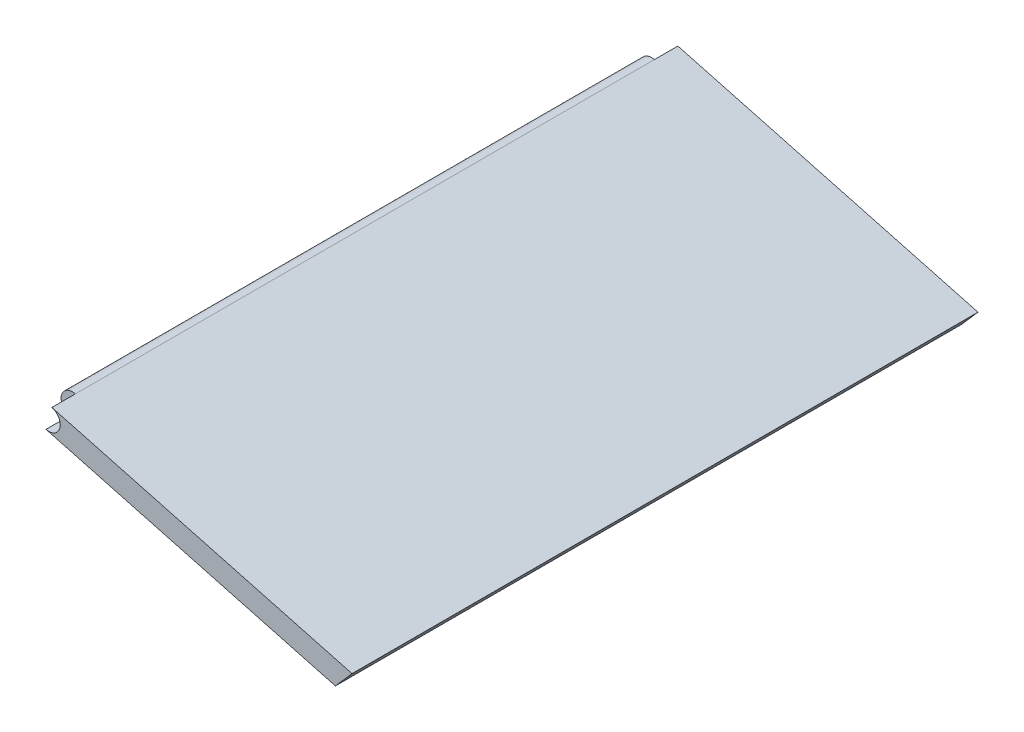
ISO-10303-21;
HEADER;
FILE_DESCRIPTION(('STEP AP214'),'2;1');
FILE_NAME('part.step','',(''),(''),'','','');
FILE_SCHEMA(('AUTOMOTIVE_DESIGN { 1 0 10303 214 1 1 1 1 }'));
ENDSEC;
DATA;
#1=APPLICATION_CONTEXT('core data for automotive mechanical design processes');
#2=APPLICATION_PROTOCOL_DEFINITION('international standard','automotive_design',2000,#1);
#3=PRODUCT_CONTEXT('',#1,'mechanical');
#4=PRODUCT('Part','Part','',(#3));
#5=PRODUCT_RELATED_PRODUCT_CATEGORY('part','',(#4));
#6=PRODUCT_DEFINITION_FORMATION('','',#4);
#7=PRODUCT_DEFINITION_CONTEXT('part definition',#1,'design');
#8=PRODUCT_DEFINITION('design','',#6,#7);
#9=PRODUCT_DEFINITION_SHAPE('','',#8);
#10=(LENGTH_UNIT() NAMED_UNIT(*) SI_UNIT(.MILLI.,.METRE.));
#11=(NAMED_UNIT(*) PLANE_ANGLE_UNIT() SI_UNIT($,.RADIAN.));
#12=(NAMED_UNIT(*) SI_UNIT($,.STERADIAN.) SOLID_ANGLE_UNIT());
#13=UNCERTAINTY_MEASURE_WITH_UNIT(LENGTH_MEASURE(1.E-05),#10,'distance_accuracy_value','');
#14=(GEOMETRIC_REPRESENTATION_CONTEXT(3) GLOBAL_UNCERTAINTY_ASSIGNED_CONTEXT((#13)) GLOBAL_UNIT_ASSIGNED_CONTEXT((#10,
#11,#12)) REPRESENTATION_CONTEXT('',''));
#15=CARTESIAN_POINT('',(0.,0.,0.));
#16=DIRECTION('',(0.,0.,1.));
#17=DIRECTION('',(1.,0.,0.));
#18=AXIS2_PLACEMENT_3D('',#15,#16,#17);
#19=CARTESIAN_POINT('',(-3.75000000000005,-13.9951905283833,840.980762113533));
#20=DIRECTION('',(0.,0.,-1.));
#21=DIRECTION('',(-1.,0.,0.));
#22=AXIS2_PLACEMENT_3D('',#19,#20,#21);
#23=CYLINDRICAL_SURFACE('',#22,14.488887394336);
#24=CARTESIAN_POINT('',(-3.75000000000005,-13.9951905283833,770.));
#25=DIRECTION('',(0.,0.,-1.));
#26=DIRECTION('',(-1.,0.,0.));
#27=AXIS2_PLACEMENT_3D('',#24,#25,#26);
#28=CIRCLE('',#27,14.488887394336);
#29=CARTESIAN_POINT('',(-7.50000000000011,-27.9903810567665,770.));
#30=VERTEX_POINT('',#29);
#31=CARTESIAN_POINT('',(0.,0.,770.));
#32=VERTEX_POINT('',#31);
#33=EDGE_CURVE('E140',#30,#32,#28,.T.);
#34=ORIENTED_EDGE('',*,*,#33,.T.);
#35=DIRECTION('',(0.,0.,-1.));
#36=VECTOR('',#35,1.);
#37=CARTESIAN_POINT('',(0.,0.,800.));
#38=LINE('',#37,#36);
#39=CARTESIAN_POINT('',(0.,0.,30.));
#40=VERTEX_POINT('',#39);
#41=EDGE_CURVE('E114',#32,#40,#38,.T.);
#42=ORIENTED_EDGE('',*,*,#41,.T.);
#43=CARTESIAN_POINT('',(-3.75000000000005,-13.9951905283833,30.));
#44=DIRECTION('',(0.,0.,-1.));
#45=DIRECTION('',(-1.,0.,0.));
#46=AXIS2_PLACEMENT_3D('',#43,#44,#45);
#47=CIRCLE('',#46,14.488887394336);
#48=CARTESIAN_POINT('',(-7.50000000000011,-27.9903810567665,30.));
#49=VERTEX_POINT('',#48);
#50=EDGE_CURVE('E11',#40,#49,#47,.F.);
#51=ORIENTED_EDGE('',*,*,#50,.T.);
#52=DIRECTION('',(0.,0.,-1.));
#53=VECTOR('',#52,1.);
#54=CARTESIAN_POINT('',(-7.50000000000011,-27.9903810567665,800.));
#55=LINE('',#54,#53);
#56=EDGE_CURVE('E49',#30,#49,#55,.T.);
#57=ORIENTED_EDGE('',*,*,#56,.F.);
#58=EDGE_LOOP('',(#34,#42,#51,#57));
#59=FACE_BOUND('',#58,.T.);
#60=ADVANCED_FACE('F34',(#59),#23,.T.);
#61=CARTESIAN_POINT('',(362.338095957555,-127.088200198859,800.));
#62=DIRECTION('',(0.258819045102525,0.965925826289067,0.));
#63=DIRECTION('',(-0.965925826289067,0.258819045102525,0.));
#64=AXIS2_PLACEMENT_3D('',#61,#62,#63);
#65=PLANE('',#64);
#66=DIRECTION('',(0.965925826289067,-0.258819045102525,0.));
#67=VECTOR('',#66,1.);
#68=CARTESIAN_POINT('',(362.338095957555,-127.088200198859,0.));
#69=LINE('',#68,#67);
#70=CARTESIAN_POINT('',(-7.50000000000011,-27.9903810567665,0.));
#71=VERTEX_POINT('',#70);
#72=CARTESIAN_POINT('',(362.338095957555,-127.088200198859,0.));
#73=VERTEX_POINT('',#72);
#74=EDGE_CURVE('E131',#71,#73,#69,.T.);
#75=ORIENTED_EDGE('',*,*,#74,.T.);
#76=DIRECTION('',(0.,0.,-1.));
#77=VECTOR('',#76,1.);
#78=CARTESIAN_POINT('',(362.338095957555,-127.088200198859,800.));
#79=LINE('',#78,#77);
#80=CARTESIAN_POINT('',(362.338095957555,-127.088200198859,800.));
#81=VERTEX_POINT('',#80);
#82=EDGE_CURVE('E117',#81,#73,#79,.T.);
#83=ORIENTED_EDGE('',*,*,#82,.F.);
#84=DIRECTION('',(0.965925826289067,-0.258819045102525,0.));
#85=VECTOR('',#84,1.);
#86=CARTESIAN_POINT('',(-7.50000000000011,-27.9903810567665,800.));
#87=LINE('',#86,#85);
#88=CARTESIAN_POINT('',(-7.50000000000011,-27.9903810567665,800.));
#89=VERTEX_POINT('',#88);
#90=EDGE_CURVE('E133',#89,#81,#87,.T.);
#91=ORIENTED_EDGE('',*,*,#90,.F.);
#92=EDGE_CURVE('E42',#89,#30,#55,.T.);
#93=ORIENTED_EDGE('',*,*,#92,.T.);
#94=ORIENTED_EDGE('',*,*,#56,.T.);
#95=EDGE_CURVE('E236',#49,#71,#55,.T.);
#96=ORIENTED_EDGE('',*,*,#95,.T.);
#97=EDGE_LOOP('',(#75,#83,#91,#93,#94,#96));
#98=FACE_BOUND('',#97,.T.);
#99=ADVANCED_FACE('F36',(#98),#65,.F.);
#100=CARTESIAN_POINT('',(383.588464135914,-102.782219191115,800.));
#101=DIRECTION('',(-0.752843184366101,0.658199923847997,0.));
#102=DIRECTION('',(-0.658199923847997,-0.752843184366101,0.));
#103=AXIS2_PLACEMENT_3D('',#100,#101,#102);
#104=PLANE('',#103);
#105=DIRECTION('',(0.658199923847997,0.752843184366101,0.));
#106=VECTOR('',#105,1.);
#107=CARTESIAN_POINT('',(383.588464135914,-102.782219191115,0.));
#108=LINE('',#107,#106);
#109=CARTESIAN_POINT('',(383.588464135914,-102.782219191115,0.));
#110=VERTEX_POINT('',#109);
#111=EDGE_CURVE('E72',#73,#110,#108,.T.);
#112=ORIENTED_EDGE('',*,*,#111,.T.);
#113=DIRECTION('',(0.,0.,-1.));
#114=VECTOR('',#113,1.);
#115=CARTESIAN_POINT('',(383.588464135914,-102.782219191115,800.));
#116=LINE('',#115,#114);
#117=CARTESIAN_POINT('',(383.588464135914,-102.782219191115,800.));
#118=VERTEX_POINT('',#117);
#119=EDGE_CURVE('E115',#118,#110,#116,.T.);
#120=ORIENTED_EDGE('',*,*,#119,.F.);
#121=DIRECTION('',(0.658199923847997,0.752843184366101,0.));
#122=VECTOR('',#121,1.);
#123=CARTESIAN_POINT('',(383.588464135914,-102.782219191115,800.));
#124=LINE('',#123,#122);
#125=EDGE_CURVE('E58',#81,#118,#124,.T.);
#126=ORIENTED_EDGE('',*,*,#125,.F.);
#127=ORIENTED_EDGE('',*,*,#82,.T.);
#128=EDGE_LOOP('',(#112,#120,#126,#127));
#129=FACE_BOUND('',#128,.T.);
#130=ADVANCED_FACE('F158',(#129),#104,.F.);
#131=CARTESIAN_POINT('',(0.,0.,800.));
#132=DIRECTION('',(-0.258819045102525,-0.965925826289067,0.));
#133=DIRECTION('',(0.965925826289067,-0.258819045102525,0.));
#134=AXIS2_PLACEMENT_3D('',#131,#132,#133);
#135=PLANE('',#134);
#136=DIRECTION('',(-0.965925826289067,0.258819045102525,0.));
#137=VECTOR('',#136,1.);
#138=CARTESIAN_POINT('',(0.,0.,0.));
#139=LINE('',#138,#137);
#140=CARTESIAN_POINT('',(0.,0.,0.));
#141=VERTEX_POINT('',#140);
#142=EDGE_CURVE('E130',#110,#141,#139,.T.);
#143=ORIENTED_EDGE('',*,*,#142,.T.);
#144=EDGE_CURVE('E108',#40,#141,#38,.T.);
#145=ORIENTED_EDGE('',*,*,#144,.F.);
#146=ORIENTED_EDGE('',*,*,#41,.F.);
#147=CARTESIAN_POINT('',(0.,0.,800.));
#148=VERTEX_POINT('',#147);
#149=EDGE_CURVE('E98',#148,#32,#38,.T.);
#150=ORIENTED_EDGE('',*,*,#149,.F.);
#151=DIRECTION('',(-0.965925826289067,0.258819045102525,0.));
#152=VECTOR('',#151,1.);
#153=CARTESIAN_POINT('',(0.,0.,800.));
#154=LINE('',#153,#152);
#155=EDGE_CURVE('E105',#118,#148,#154,.T.);
#156=ORIENTED_EDGE('',*,*,#155,.F.);
#157=ORIENTED_EDGE('',*,*,#119,.T.);
#158=EDGE_LOOP('',(#143,#145,#146,#150,#156,#157));
#159=FACE_BOUND('',#158,.T.);
#160=ADVANCED_FACE('F112',(#159),#135,.F.);
#161=CARTESIAN_POINT('',(0.,0.,800.));
#162=DIRECTION('',(0.,0.,1.));
#163=DIRECTION('',(1.,0.,0.));
#164=AXIS2_PLACEMENT_3D('',#161,#162,#163);
#165=PLANE('',#164);
#166=CARTESIAN_POINT('',(-3.75000000000005,-13.9951905283833,800.));
#167=DIRECTION('',(0.,0.,-1.));
#168=DIRECTION('',(-1.,0.,0.));
#169=AXIS2_PLACEMENT_3D('',#166,#167,#168);
#170=CIRCLE('',#169,14.488887394336);
#171=EDGE_CURVE('E95',#148,#89,#170,.T.);
#172=ORIENTED_EDGE('',*,*,#171,.T.);
#173=ORIENTED_EDGE('',*,*,#90,.T.);
#174=ORIENTED_EDGE('',*,*,#125,.T.);
#175=ORIENTED_EDGE('',*,*,#155,.T.);
#176=EDGE_LOOP('',(#172,#173,#174,#175));
#177=FACE_BOUND('',#176,.T.);
#178=ADVANCED_FACE('F106',(#177),#165,.T.);
#179=CARTESIAN_POINT('',(0.,0.,0.));
#180=DIRECTION('',(0.,0.,1.));
#181=DIRECTION('',(1.,0.,0.));
#182=AXIS2_PLACEMENT_3D('',#179,#180,#181);
#183=PLANE('',#182);
#184=ORIENTED_EDGE('',*,*,#74,.F.);
#185=CARTESIAN_POINT('',(-3.75000000000005,-13.9951905283833,0.));
#186=DIRECTION('',(0.,0.,-1.));
#187=DIRECTION('',(-1.,0.,0.));
#188=AXIS2_PLACEMENT_3D('',#185,#186,#187);
#189=CIRCLE('',#188,14.488887394336);
#190=EDGE_CURVE('E101',#141,#71,#189,.T.);
#191=ORIENTED_EDGE('',*,*,#190,.F.);
#192=ORIENTED_EDGE('',*,*,#142,.F.);
#193=ORIENTED_EDGE('',*,*,#111,.F.);
#194=EDGE_LOOP('',(#184,#191,#192,#193));
#195=FACE_BOUND('',#194,.T.);
#196=ADVANCED_FACE('F129',(#195),#183,.F.);
#197=CARTESIAN_POINT('',(-3.75000000000005,-13.9951905283833,30.));
#198=DIRECTION('',(0.,0.,-1.));
#199=DIRECTION('',(-1.,0.,0.));
#200=AXIS2_PLACEMENT_3D('',#197,#198,#199);
#201=CYLINDRICAL_SURFACE('',#200,14.488887394336);
#202=CARTESIAN_POINT('',(-3.75000000000005,-13.9951905283833,30.));
#203=DIRECTION('',(0.,0.,-1.));
#204=DIRECTION('',(-1.,0.,0.));
#205=AXIS2_PLACEMENT_3D('',#202,#203,#204);
#206=CIRCLE('',#205,14.488887394336);
#207=EDGE_CURVE('E125',#40,#49,#206,.T.);
#208=ORIENTED_EDGE('',*,*,#207,.F.);
#209=ORIENTED_EDGE('',*,*,#144,.T.);
#210=ORIENTED_EDGE('',*,*,#190,.T.);
#211=ORIENTED_EDGE('',*,*,#95,.F.);
#212=EDGE_LOOP('',(#208,#209,#210,#211));
#213=FACE_BOUND('',#212,.T.);
#214=ADVANCED_FACE('F123',(#213),#201,.F.);
#215=CARTESIAN_POINT('',(-3.75000000000005,-13.9951905283833,30.));
#216=DIRECTION('',(0.,0.,-1.));
#217=DIRECTION('',(-1.,0.,0.));
#218=AXIS2_PLACEMENT_3D('',#215,#216,#217);
#219=PLANE('',#218);
#220=ORIENTED_EDGE('',*,*,#207,.T.);
#221=ORIENTED_EDGE('',*,*,#50,.F.);
#222=EDGE_LOOP('',(#220,#221));
#223=FACE_BOUND('',#222,.T.);
#224=ADVANCED_FACE('F151',(#223),#219,.T.);
#225=CARTESIAN_POINT('',(-3.75000000000005,-13.9951905283833,800.));
#226=DIRECTION('',(0.,0.,-1.));
#227=DIRECTION('',(-1.,0.,0.));
#228=AXIS2_PLACEMENT_3D('',#225,#226,#227);
#229=CYLINDRICAL_SURFACE('',#228,14.488887394336);
#230=ORIENTED_EDGE('',*,*,#171,.F.);
#231=ORIENTED_EDGE('',*,*,#149,.T.);
#232=EDGE_CURVE('E102',#32,#30,#28,.T.);
#233=ORIENTED_EDGE('',*,*,#232,.T.);
#234=ORIENTED_EDGE('',*,*,#92,.F.);
#235=EDGE_LOOP('',(#230,#231,#233,#234));
#236=FACE_BOUND('',#235,.T.);
#237=ADVANCED_FACE('F96',(#236),#229,.F.);
#238=CARTESIAN_POINT('',(-3.75000000000005,-13.9951905283833,770.));
#239=DIRECTION('',(0.,0.,-1.));
#240=DIRECTION('',(-1.,0.,0.));
#241=AXIS2_PLACEMENT_3D('',#238,#239,#240);
#242=PLANE('',#241);
#243=ORIENTED_EDGE('',*,*,#232,.F.);
#244=ORIENTED_EDGE('',*,*,#33,.F.);
#245=EDGE_LOOP('',(#243,#244));
#246=FACE_BOUND('',#245,.T.);
#247=ADVANCED_FACE('F145',(#246),#242,.F.);
#248=CLOSED_SHELL('',(#60,#99,#130,#160,#178,#196,#214,#224,#237,#247));
#249=MANIFOLD_SOLID_BREP('B2',#248);
#250=ADVANCED_BREP_SHAPE_REPRESENTATION('',(#18,#249),#14);
#251=SHAPE_DEFINITION_REPRESENTATION(#9,#250);
ENDSEC;
END-ISO-10303-21;
